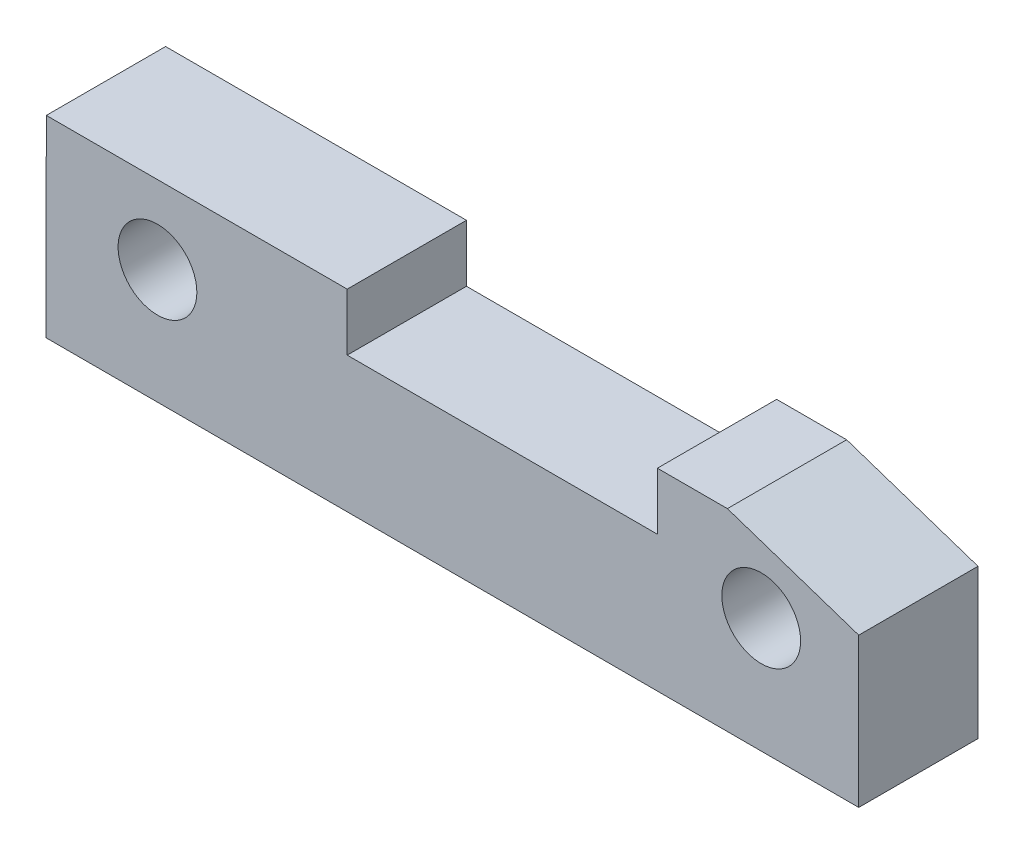
ISO-10303-21;
HEADER;
FILE_DESCRIPTION(('STEP AP214'),'2;1');
FILE_NAME('part.step','',(''),(''),'','','');
FILE_SCHEMA(('AUTOMOTIVE_DESIGN { 1 0 10303 214 1 1 1 1 }'));
ENDSEC;
DATA;
#1=APPLICATION_CONTEXT('core data for automotive mechanical design processes');
#2=APPLICATION_PROTOCOL_DEFINITION('international standard','automotive_design',2000,#1);
#3=PRODUCT_CONTEXT('',#1,'mechanical');
#4=PRODUCT('Part','Part','',(#3));
#5=PRODUCT_RELATED_PRODUCT_CATEGORY('part','',(#4));
#6=PRODUCT_DEFINITION_FORMATION('','',#4);
#7=PRODUCT_DEFINITION_CONTEXT('part definition',#1,'design');
#8=PRODUCT_DEFINITION('design','',#6,#7);
#9=PRODUCT_DEFINITION_SHAPE('','',#8);
#10=(LENGTH_UNIT() NAMED_UNIT(*) SI_UNIT(.MILLI.,.METRE.));
#11=(NAMED_UNIT(*) PLANE_ANGLE_UNIT() SI_UNIT($,.RADIAN.));
#12=(NAMED_UNIT(*) SI_UNIT($,.STERADIAN.) SOLID_ANGLE_UNIT());
#13=UNCERTAINTY_MEASURE_WITH_UNIT(LENGTH_MEASURE(1.E-05),#10,'distance_accuracy_value','');
#14=(GEOMETRIC_REPRESENTATION_CONTEXT(3) GLOBAL_UNCERTAINTY_ASSIGNED_CONTEXT((#13)) GLOBAL_UNIT_ASSIGNED_CONTEXT((#10,
#11,#12)) REPRESENTATION_CONTEXT('',''));
#15=CARTESIAN_POINT('',(0.,0.,0.));
#16=DIRECTION('',(0.,0.,1.));
#17=DIRECTION('',(1.,0.,0.));
#18=AXIS2_PLACEMENT_3D('',#15,#16,#17);
#19=CARTESIAN_POINT('',(0.,0.,-5.));
#20=DIRECTION('',(-0.999998734873427,0.00159067644258908,0.));
#21=DIRECTION('',(-0.00159067644258908,-0.999998734873427,0.));
#22=AXIS2_PLACEMENT_3D('',#19,#20,#21);
#23=PLANE('',#22);
#24=DIRECTION('',(-0.00159067644258908,-0.999998734873427,0.));
#25=VECTOR('',#24,1.);
#26=CARTESIAN_POINT('',(0.,0.,0.));
#27=LINE('',#26,#25);
#28=CARTESIAN_POINT('',(0.0128524133091474,8.079831136682,0.));
#29=VERTEX_POINT('',#28);
#30=CARTESIAN_POINT('',(0.,0.,0.));
#31=VERTEX_POINT('',#30);
#32=EDGE_CURVE('E147',#29,#31,#27,.T.);
#33=ORIENTED_EDGE('',*,*,#32,.F.);
#34=DIRECTION('',(0.,0.,1.));
#35=VECTOR('',#34,1.);
#36=CARTESIAN_POINT('',(0.0128524133091474,8.079831136682,-5.));
#37=LINE('',#36,#35);
#38=CARTESIAN_POINT('',(0.0128524133091474,8.079831136682,-5.));
#39=VERTEX_POINT('',#38);
#40=EDGE_CURVE('E13',#39,#29,#37,.T.);
#41=ORIENTED_EDGE('',*,*,#40,.F.);
#42=DIRECTION('',(-0.00159067644258908,-0.999998734873427,0.));
#43=VECTOR('',#42,1.);
#44=CARTESIAN_POINT('',(0.,0.,-5.));
#45=LINE('',#44,#43);
#46=CARTESIAN_POINT('',(0.,0.,-5.));
#47=VERTEX_POINT('',#46);
#48=EDGE_CURVE('E171',#39,#47,#45,.T.);
#49=ORIENTED_EDGE('',*,*,#48,.T.);
#50=DIRECTION('',(0.,0.,1.));
#51=VECTOR('',#50,1.);
#52=CARTESIAN_POINT('',(0.,0.,-5.));
#53=LINE('',#52,#51);
#54=EDGE_CURVE('E47',#47,#31,#53,.T.);
#55=ORIENTED_EDGE('',*,*,#54,.T.);
#56=EDGE_LOOP('',(#33,#41,#49,#55));
#57=FACE_BOUND('',#56,.T.);
#58=ADVANCED_FACE('F44',(#57),#23,.T.);
#59=CARTESIAN_POINT('',(0.0128524133091474,8.079831136682,-5.));
#60=DIRECTION('',(0.,1.,0.));
#61=DIRECTION('',(0.,0.,1.));
#62=AXIS2_PLACEMENT_3D('',#59,#60,#61);
#63=PLANE('',#62);
#64=DIRECTION('',(-1.,0.,0.));
#65=VECTOR('',#64,1.);
#66=CARTESIAN_POINT('',(0.0128524133091474,8.079831136682,0.));
#67=LINE('',#66,#65);
#68=CARTESIAN_POINT('',(12.6274096323782,8.079831136682,0.));
#69=VERTEX_POINT('',#68);
#70=EDGE_CURVE('E169',#69,#29,#67,.T.);
#71=ORIENTED_EDGE('',*,*,#70,.F.);
#72=DIRECTION('',(0.,0.,1.));
#73=VECTOR('',#72,1.);
#74=CARTESIAN_POINT('',(12.6274096323782,8.079831136682,-5.));
#75=LINE('',#74,#73);
#76=CARTESIAN_POINT('',(12.6274096323782,8.079831136682,-5.));
#77=VERTEX_POINT('',#76);
#78=EDGE_CURVE('E53',#77,#69,#75,.T.);
#79=ORIENTED_EDGE('',*,*,#78,.F.);
#80=DIRECTION('',(-1.,0.,0.));
#81=VECTOR('',#80,1.);
#82=CARTESIAN_POINT('',(0.0128524133091474,8.079831136682,-5.));
#83=LINE('',#82,#81);
#84=EDGE_CURVE('E137',#77,#39,#83,.T.);
#85=ORIENTED_EDGE('',*,*,#84,.T.);
#86=ORIENTED_EDGE('',*,*,#40,.T.);
#87=EDGE_LOOP('',(#71,#79,#85,#86));
#88=FACE_BOUND('',#87,.T.);
#89=ADVANCED_FACE('F185',(#88),#63,.T.);
#90=CARTESIAN_POINT('',(12.6274096323782,8.079831136682,-5.));
#91=DIRECTION('',(1.,0.,0.));
#92=DIRECTION('',(0.,0.,-1.));
#93=AXIS2_PLACEMENT_3D('',#90,#91,#92);
#94=PLANE('',#93);
#95=DIRECTION('',(0.,1.,0.));
#96=VECTOR('',#95,1.);
#97=CARTESIAN_POINT('',(12.6274096323782,8.079831136682,0.));
#98=LINE('',#97,#96);
#99=CARTESIAN_POINT('',(12.6274096323782,5.6827414756147,0.));
#100=VERTEX_POINT('',#99);
#101=EDGE_CURVE('E124',#100,#69,#98,.T.);
#102=ORIENTED_EDGE('',*,*,#101,.F.);
#103=DIRECTION('',(0.,0.,1.));
#104=VECTOR('',#103,1.);
#105=CARTESIAN_POINT('',(12.6274096323782,5.6827414756147,-5.));
#106=LINE('',#105,#104);
#107=CARTESIAN_POINT('',(12.6274096323782,5.6827414756147,-5.));
#108=VERTEX_POINT('',#107);
#109=EDGE_CURVE('E119',#108,#100,#106,.T.);
#110=ORIENTED_EDGE('',*,*,#109,.F.);
#111=DIRECTION('',(0.,1.,0.));
#112=VECTOR('',#111,1.);
#113=CARTESIAN_POINT('',(12.6274096323782,8.079831136682,-5.));
#114=LINE('',#113,#112);
#115=EDGE_CURVE('E122',#108,#77,#114,.T.);
#116=ORIENTED_EDGE('',*,*,#115,.T.);
#117=ORIENTED_EDGE('',*,*,#78,.T.);
#118=EDGE_LOOP('',(#102,#110,#116,#117));
#119=FACE_BOUND('',#118,.T.);
#120=ADVANCED_FACE('F121',(#119),#94,.T.);
#121=CARTESIAN_POINT('',(12.6274096323782,5.6827414756147,-5.));
#122=DIRECTION('',(0.,1.,0.));
#123=DIRECTION('',(0.,0.,1.));
#124=AXIS2_PLACEMENT_3D('',#121,#122,#123);
#125=PLANE('',#124);
#126=DIRECTION('',(-1.,0.,0.));
#127=VECTOR('',#126,1.);
#128=CARTESIAN_POINT('',(12.6274096323782,5.6827414756147,0.));
#129=LINE('',#128,#127);
#130=CARTESIAN_POINT('',(25.6309396291265,5.6827414756147,0.));
#131=VERTEX_POINT('',#130);
#132=EDGE_CURVE('E166',#131,#100,#129,.T.);
#133=ORIENTED_EDGE('',*,*,#132,.F.);
#134=DIRECTION('',(0.,0.,1.));
#135=VECTOR('',#134,1.);
#136=CARTESIAN_POINT('',(25.6309396291265,5.6827414756147,-5.));
#137=LINE('',#136,#135);
#138=CARTESIAN_POINT('',(25.6309396291265,5.6827414756147,-5.));
#139=VERTEX_POINT('',#138);
#140=EDGE_CURVE('E129',#139,#131,#137,.T.);
#141=ORIENTED_EDGE('',*,*,#140,.F.);
#142=DIRECTION('',(-1.,0.,0.));
#143=VECTOR('',#142,1.);
#144=CARTESIAN_POINT('',(12.6274096323782,5.6827414756147,-5.));
#145=LINE('',#144,#143);
#146=EDGE_CURVE('E135',#139,#108,#145,.T.);
#147=ORIENTED_EDGE('',*,*,#146,.T.);
#148=ORIENTED_EDGE('',*,*,#109,.T.);
#149=EDGE_LOOP('',(#133,#141,#147,#148));
#150=FACE_BOUND('',#149,.T.);
#151=ADVANCED_FACE('F139',(#150),#125,.T.);
#152=CARTESIAN_POINT('',(25.6309396291265,5.6827414756147,-5.));
#153=DIRECTION('',(-1.,0.,0.));
#154=DIRECTION('',(0.,0.,1.));
#155=AXIS2_PLACEMENT_3D('',#152,#153,#154);
#156=PLANE('',#155);
#157=DIRECTION('',(0.,-1.,0.));
#158=VECTOR('',#157,1.);
#159=CARTESIAN_POINT('',(25.6309396291265,5.6827414756147,0.));
#160=LINE('',#159,#158);
#161=CARTESIAN_POINT('',(25.6309396291265,8.079831136682,0.));
#162=VERTEX_POINT('',#161);
#163=EDGE_CURVE('E163',#162,#131,#160,.T.);
#164=ORIENTED_EDGE('',*,*,#163,.F.);
#165=DIRECTION('',(0.,0.,1.));
#166=VECTOR('',#165,1.);
#167=CARTESIAN_POINT('',(25.6309396291265,8.079831136682,-5.));
#168=LINE('',#167,#166);
#169=CARTESIAN_POINT('',(25.6309396291265,8.079831136682,-5.));
#170=VERTEX_POINT('',#169);
#171=EDGE_CURVE('E175',#170,#162,#168,.T.);
#172=ORIENTED_EDGE('',*,*,#171,.F.);
#173=DIRECTION('',(0.,-1.,0.));
#174=VECTOR('',#173,1.);
#175=CARTESIAN_POINT('',(25.6309396291265,5.6827414756147,-5.));
#176=LINE('',#175,#174);
#177=EDGE_CURVE('E140',#170,#139,#176,.T.);
#178=ORIENTED_EDGE('',*,*,#177,.T.);
#179=ORIENTED_EDGE('',*,*,#140,.T.);
#180=EDGE_LOOP('',(#164,#172,#178,#179));
#181=FACE_BOUND('',#180,.T.);
#182=ADVANCED_FACE('F198',(#181),#156,.T.);
#183=CARTESIAN_POINT('',(25.6309396291265,8.079831136682,-5.));
#184=DIRECTION('',(0.,1.,0.));
#185=DIRECTION('',(0.,0.,1.));
#186=AXIS2_PLACEMENT_3D('',#183,#184,#185);
#187=PLANE('',#186);
#188=DIRECTION('',(-1.,0.,0.));
#189=VECTOR('',#188,1.);
#190=CARTESIAN_POINT('',(25.6309396291265,8.079831136682,0.));
#191=LINE('',#190,#189);
#192=CARTESIAN_POINT('',(28.5658037950598,8.079831136682,0.));
#193=VERTEX_POINT('',#192);
#194=EDGE_CURVE('E160',#193,#162,#191,.T.);
#195=ORIENTED_EDGE('',*,*,#194,.F.);
#196=DIRECTION('',(0.,0.,1.));
#197=VECTOR('',#196,1.);
#198=CARTESIAN_POINT('',(28.5658037950598,8.079831136682,-5.));
#199=LINE('',#198,#197);
#200=CARTESIAN_POINT('',(28.5658037950598,8.079831136682,-5.));
#201=VERTEX_POINT('',#200);
#202=EDGE_CURVE('E177',#201,#193,#199,.T.);
#203=ORIENTED_EDGE('',*,*,#202,.F.);
#204=DIRECTION('',(-1.,0.,0.));
#205=VECTOR('',#204,1.);
#206=CARTESIAN_POINT('',(25.6309396291265,8.079831136682,-5.));
#207=LINE('',#206,#205);
#208=EDGE_CURVE('E142',#201,#170,#207,.T.);
#209=ORIENTED_EDGE('',*,*,#208,.T.);
#210=ORIENTED_EDGE('',*,*,#171,.T.);
#211=EDGE_LOOP('',(#195,#203,#209,#210));
#212=FACE_BOUND('',#211,.T.);
#213=ADVANCED_FACE('F201',(#212),#187,.T.);
#214=CARTESIAN_POINT('',(28.5658037950598,8.079831136682,-5.));
#215=DIRECTION('',(0.317011550775875,0.948421676615773,0.));
#216=DIRECTION('',(-0.948421676615773,0.317011550775875,0.));
#217=AXIS2_PLACEMENT_3D('',#214,#215,#216);
#218=PLANE('',#217);
#219=DIRECTION('',(-0.948421676615773,0.317011550775875,0.));
#220=VECTOR('',#219,1.);
#221=CARTESIAN_POINT('',(28.5658037950598,8.079831136682,0.));
#222=LINE('',#221,#220);
#223=CARTESIAN_POINT('',(34.0717476825718,6.23946007252269,0.));
#224=VERTEX_POINT('',#223);
#225=EDGE_CURVE('E157',#224,#193,#222,.T.);
#226=ORIENTED_EDGE('',*,*,#225,.F.);
#227=DIRECTION('',(0.,0.,1.));
#228=VECTOR('',#227,1.);
#229=CARTESIAN_POINT('',(34.0717476825718,6.23946007252269,-5.));
#230=LINE('',#229,#228);
#231=CARTESIAN_POINT('',(34.0717476825718,6.23946007252269,-5.));
#232=VERTEX_POINT('',#231);
#233=EDGE_CURVE('E179',#232,#224,#230,.T.);
#234=ORIENTED_EDGE('',*,*,#233,.F.);
#235=DIRECTION('',(-0.948421676615773,0.317011550775875,0.));
#236=VECTOR('',#235,1.);
#237=CARTESIAN_POINT('',(28.5658037950598,8.079831136682,-5.));
#238=LINE('',#237,#236);
#239=EDGE_CURVE('E254',#232,#201,#238,.T.);
#240=ORIENTED_EDGE('',*,*,#239,.T.);
#241=ORIENTED_EDGE('',*,*,#202,.T.);
#242=EDGE_LOOP('',(#226,#234,#240,#241));
#243=FACE_BOUND('',#242,.T.);
#244=ADVANCED_FACE('F205',(#243),#218,.T.);
#245=CARTESIAN_POINT('',(34.0717476825718,6.23946007252269,-5.));
#246=DIRECTION('',(1.,0.,0.));
#247=DIRECTION('',(0.,0.,-1.));
#248=AXIS2_PLACEMENT_3D('',#245,#246,#247);
#249=PLANE('',#248);
#250=DIRECTION('',(0.,1.,0.));
#251=VECTOR('',#250,1.);
#252=CARTESIAN_POINT('',(34.0717476825718,6.23946007252269,0.));
#253=LINE('',#252,#251);
#254=CARTESIAN_POINT('',(34.0717476825718,-0.0175122678486161,0.));
#255=VERTEX_POINT('',#254);
#256=EDGE_CURVE('E154',#255,#224,#253,.T.);
#257=ORIENTED_EDGE('',*,*,#256,.F.);
#258=DIRECTION('',(0.,0.,1.));
#259=VECTOR('',#258,1.);
#260=CARTESIAN_POINT('',(34.0717476825718,-0.0175122678486161,-5.));
#261=LINE('',#260,#259);
#262=CARTESIAN_POINT('',(34.0717476825718,-0.0175122678486161,-5.));
#263=VERTEX_POINT('',#262);
#264=EDGE_CURVE('E180',#263,#255,#261,.T.);
#265=ORIENTED_EDGE('',*,*,#264,.F.);
#266=DIRECTION('',(0.,1.,0.));
#267=VECTOR('',#266,1.);
#268=CARTESIAN_POINT('',(34.0717476825718,6.23946007252269,-5.));
#269=LINE('',#268,#267);
#270=EDGE_CURVE('E251',#263,#232,#269,.T.);
#271=ORIENTED_EDGE('',*,*,#270,.T.);
#272=ORIENTED_EDGE('',*,*,#233,.T.);
#273=EDGE_LOOP('',(#257,#265,#271,#272));
#274=FACE_BOUND('',#273,.T.);
#275=ADVANCED_FACE('F209',(#274),#249,.T.);
#276=CARTESIAN_POINT('',(34.0717476825718,-0.0175122678486161,-5.));
#277=DIRECTION('',(-0.000513982015204935,-0.999999867911235,0.));
#278=DIRECTION('',(0.999999867911235,-0.000513982015204935,0.));
#279=AXIS2_PLACEMENT_3D('',#276,#277,#278);
#280=PLANE('',#279);
#281=DIRECTION('',(0.999999867911235,-0.000513982015204935,0.));
#282=VECTOR('',#281,1.);
#283=CARTESIAN_POINT('',(34.0717476825718,-0.0175122678486161,0.));
#284=LINE('',#283,#282);
#285=EDGE_CURVE('E150',#31,#255,#284,.T.);
#286=ORIENTED_EDGE('',*,*,#285,.F.);
#287=ORIENTED_EDGE('',*,*,#54,.F.);
#288=DIRECTION('',(0.999999867911235,-0.000513982015204935,0.));
#289=VECTOR('',#288,1.);
#290=CARTESIAN_POINT('',(34.0717476825718,-0.0175122678486161,-5.));
#291=LINE('',#290,#289);
#292=EDGE_CURVE('E249',#47,#263,#291,.T.);
#293=ORIENTED_EDGE('',*,*,#292,.T.);
#294=ORIENTED_EDGE('',*,*,#264,.T.);
#295=EDGE_LOOP('',(#286,#287,#293,#294));
#296=FACE_BOUND('',#295,.T.);
#297=ADVANCED_FACE('F182',(#296),#280,.T.);
#298=CARTESIAN_POINT('',(0.,0.,-5.));
#299=DIRECTION('',(0.,0.,1.));
#300=DIRECTION('',(1.,0.,0.));
#301=AXIS2_PLACEMENT_3D('',#298,#299,#300);
#302=PLANE('',#301);
#303=CARTESIAN_POINT('',(29.9831237947058,4.80940739814129,-5.));
#304=DIRECTION('',(0.,0.,1.));
#305=DIRECTION('',(1.,0.,0.));
#306=AXIS2_PLACEMENT_3D('',#303,#304,#305);
#307=CIRCLE('',#306,1.6508915576362);
#308=CARTESIAN_POINT('',(31.634015352342,4.80940739814129,-5.));
#309=VERTEX_POINT('',#308);
#310=EDGE_CURVE('E236',#309,#309,#307,.T.);
#311=ORIENTED_EDGE('',*,*,#310,.T.);
#312=EDGE_LOOP('',(#311));
#313=FACE_BOUND('',#312,.T.);
#314=CARTESIAN_POINT('',(4.67338199547723,4.80905205345988,-5.));
#315=DIRECTION('',(0.,0.,1.));
#316=DIRECTION('',(1.,0.,0.));
#317=AXIS2_PLACEMENT_3D('',#314,#315,#316);
#318=CIRCLE('',#317,1.65087652736507);
#319=CARTESIAN_POINT('',(6.3242585228423,4.80905205345988,-5.));
#320=VERTEX_POINT('',#319);
#321=EDGE_CURVE('E151',#320,#320,#318,.T.);
#322=ORIENTED_EDGE('',*,*,#321,.T.);
#323=EDGE_LOOP('',(#322));
#324=FACE_BOUND('',#323,.T.);
#325=ORIENTED_EDGE('',*,*,#48,.F.);
#326=ORIENTED_EDGE('',*,*,#84,.F.);
#327=ORIENTED_EDGE('',*,*,#115,.F.);
#328=ORIENTED_EDGE('',*,*,#146,.F.);
#329=ORIENTED_EDGE('',*,*,#177,.F.);
#330=ORIENTED_EDGE('',*,*,#208,.F.);
#331=ORIENTED_EDGE('',*,*,#239,.F.);
#332=ORIENTED_EDGE('',*,*,#270,.F.);
#333=ORIENTED_EDGE('',*,*,#292,.F.);
#334=EDGE_LOOP('',(#325,#326,#327,#328,#329,#330,#331,#332,#333));
#335=FACE_BOUND('',#334,.T.);
#336=ADVANCED_FACE('F133',(#313,#324,#335),#302,.F.);
#337=CARTESIAN_POINT('',(0.,0.,0.));
#338=DIRECTION('',(0.,0.,1.));
#339=DIRECTION('',(1.,0.,0.));
#340=AXIS2_PLACEMENT_3D('',#337,#338,#339);
#341=PLANE('',#340);
#342=CARTESIAN_POINT('',(29.9831237947058,4.80940739814129,0.));
#343=DIRECTION('',(0.,0.,1.));
#344=DIRECTION('',(1.,0.,0.));
#345=AXIS2_PLACEMENT_3D('',#342,#343,#344);
#346=CIRCLE('',#345,1.6508915576362);
#347=CARTESIAN_POINT('',(31.634015352342,4.80940739814129,0.));
#348=VERTEX_POINT('',#347);
#349=EDGE_CURVE('E239',#348,#348,#346,.T.);
#350=ORIENTED_EDGE('',*,*,#349,.F.);
#351=EDGE_LOOP('',(#350));
#352=FACE_BOUND('',#351,.T.);
#353=CARTESIAN_POINT('',(4.67338199547723,4.80905205345988,0.));
#354=DIRECTION('',(0.,0.,1.));
#355=DIRECTION('',(1.,0.,0.));
#356=AXIS2_PLACEMENT_3D('',#353,#354,#355);
#357=CIRCLE('',#356,1.65087652736507);
#358=CARTESIAN_POINT('',(6.3242585228423,4.80905205345988,0.));
#359=VERTEX_POINT('',#358);
#360=EDGE_CURVE('E241',#359,#359,#357,.T.);
#361=ORIENTED_EDGE('',*,*,#360,.F.);
#362=EDGE_LOOP('',(#361));
#363=FACE_BOUND('',#362,.T.);
#364=ORIENTED_EDGE('',*,*,#32,.T.);
#365=ORIENTED_EDGE('',*,*,#285,.T.);
#366=ORIENTED_EDGE('',*,*,#256,.T.);
#367=ORIENTED_EDGE('',*,*,#225,.T.);
#368=ORIENTED_EDGE('',*,*,#194,.T.);
#369=ORIENTED_EDGE('',*,*,#163,.T.);
#370=ORIENTED_EDGE('',*,*,#132,.T.);
#371=ORIENTED_EDGE('',*,*,#101,.T.);
#372=ORIENTED_EDGE('',*,*,#70,.T.);
#373=EDGE_LOOP('',(#364,#365,#366,#367,#368,#369,#370,#371,#372));
#374=FACE_BOUND('',#373,.T.);
#375=ADVANCED_FACE('F184',(#352,#363,#374),#341,.T.);
#376=CARTESIAN_POINT('',(4.67338199547723,4.80905205345988,-5.));
#377=DIRECTION('',(0.,0.,1.));
#378=DIRECTION('',(1.,0.,0.));
#379=AXIS2_PLACEMENT_3D('',#376,#377,#378);
#380=CYLINDRICAL_SURFACE('',#379,1.65087652736507);
#381=ORIENTED_EDGE('',*,*,#321,.F.);
#382=EDGE_LOOP('',(#381));
#383=FACE_BOUND('',#382,.T.);
#384=ORIENTED_EDGE('',*,*,#360,.T.);
#385=EDGE_LOOP('',(#384));
#386=FACE_BOUND('',#385,.T.);
#387=ADVANCED_FACE('F221',(#383,#386),#380,.F.);
#388=CARTESIAN_POINT('',(29.9831237947058,4.80940739814129,-5.));
#389=DIRECTION('',(0.,0.,1.));
#390=DIRECTION('',(1.,0.,0.));
#391=AXIS2_PLACEMENT_3D('',#388,#389,#390);
#392=CYLINDRICAL_SURFACE('',#391,1.6508915576362);
#393=ORIENTED_EDGE('',*,*,#310,.F.);
#394=EDGE_LOOP('',(#393));
#395=FACE_BOUND('',#394,.T.);
#396=ORIENTED_EDGE('',*,*,#349,.T.);
#397=EDGE_LOOP('',(#396));
#398=FACE_BOUND('',#397,.T.);
#399=ADVANCED_FACE('F228',(#395,#398),#392,.F.);
#400=CLOSED_SHELL('',(#58,#89,#120,#151,#182,#213,#244,#275,#297,#336,#375,#387,#399));
#401=MANIFOLD_SOLID_BREP('B2',#400);
#402=ADVANCED_BREP_SHAPE_REPRESENTATION('',(#18,#401),#14);
#403=SHAPE_DEFINITION_REPRESENTATION(#9,#402);
ENDSEC;
END-ISO-10303-21;
